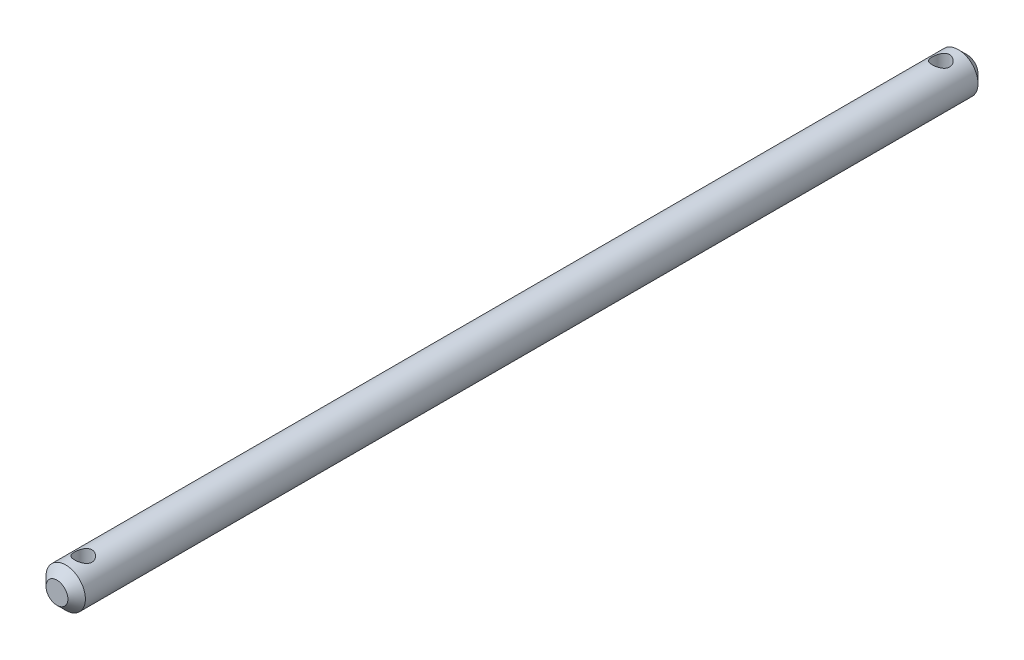
ISO-10303-21;
HEADER;
FILE_DESCRIPTION(('STEP AP214'),'2;1');
FILE_NAME('part.step','',(''),(''),'','','');
FILE_SCHEMA(('AUTOMOTIVE_DESIGN { 1 0 10303 214 1 1 1 1 }'));
ENDSEC;
DATA;
#1=APPLICATION_CONTEXT('core data for automotive mechanical design processes');
#2=APPLICATION_PROTOCOL_DEFINITION('international standard','automotive_design',2000,#1);
#3=PRODUCT_CONTEXT('',#1,'mechanical');
#4=PRODUCT('Part','Part','',(#3));
#5=PRODUCT_RELATED_PRODUCT_CATEGORY('part','',(#4));
#6=PRODUCT_DEFINITION_FORMATION('','',#4);
#7=PRODUCT_DEFINITION_CONTEXT('part definition',#1,'design');
#8=PRODUCT_DEFINITION('design','',#6,#7);
#9=PRODUCT_DEFINITION_SHAPE('','',#8);
#10=(LENGTH_UNIT() NAMED_UNIT(*) SI_UNIT(.MILLI.,.METRE.));
#11=(NAMED_UNIT(*) PLANE_ANGLE_UNIT() SI_UNIT($,.RADIAN.));
#12=(NAMED_UNIT(*) SI_UNIT($,.STERADIAN.) SOLID_ANGLE_UNIT());
#13=UNCERTAINTY_MEASURE_WITH_UNIT(LENGTH_MEASURE(1.E-05),#10,'distance_accuracy_value','');
#14=(GEOMETRIC_REPRESENTATION_CONTEXT(3) GLOBAL_UNCERTAINTY_ASSIGNED_CONTEXT((#13)) GLOBAL_UNIT_ASSIGNED_CONTEXT((#10,
#11,#12)) REPRESENTATION_CONTEXT('',''));
#15=CARTESIAN_POINT('',(0.,0.,0.));
#16=DIRECTION('',(0.,0.,1.));
#17=DIRECTION('',(1.,0.,0.));
#18=AXIS2_PLACEMENT_3D('',#15,#16,#17);
#19=CARTESIAN_POINT('',(0.,0.,104.));
#20=DIRECTION('',(0.,0.,-1.));
#21=DIRECTION('',(-1.,0.,0.));
#22=AXIS2_PLACEMENT_3D('',#19,#20,#21);
#23=CYLINDRICAL_SURFACE('',#22,2.25);
#24=CARTESIAN_POINT('',(0.,-2.25,4.));
#25=CARTESIAN_POINT('',(0.053255465918589,-2.24999511135048,3.99999365264944));
#26=CARTESIAN_POINT('',(0.106577530436506,-2.24808803498228,3.99572124318931));
#27=CARTESIAN_POINT('',(0.211696313341408,-2.24064250175497,3.97879181433044));
#28=CARTESIAN_POINT('',(0.263489053440063,-2.23509531958046,3.96611464801579));
#29=CARTESIAN_POINT('',(0.36385091696647,-2.22096174879085,3.93294949085821));
#30=CARTESIAN_POINT('',(0.412430824006015,-2.21238621117243,3.91248936743266));
#31=CARTESIAN_POINT('',(0.505415730249006,-2.19301475825376,3.86446243318386));
#32=CARTESIAN_POINT('',(0.549821677957486,-2.1822193491909,3.83689724229485));
#33=CARTESIAN_POINT('',(0.635739992499941,-2.15879993616987,3.77383255859854));
#34=CARTESIAN_POINT('',(0.676990818164824,-2.14611090344928,3.73800117271612));
#35=CARTESIAN_POINT('',(0.75312832500485,-2.12059265317293,3.66012587409605));
#36=CARTESIAN_POINT('',(0.788011212567854,-2.10776335684879,3.61807828495734));
#37=CARTESIAN_POINT('',(0.852423036191426,-2.08258023551527,3.52603063733206));
#38=CARTESIAN_POINT('',(0.881526558016591,-2.07029663189321,3.47571159239589));
#39=CARTESIAN_POINT('',(0.930740290188398,-2.04864605580411,3.37027237699269));
#40=CARTESIAN_POINT('',(0.950855750666059,-2.03927738163432,3.31515503186411));
#41=CARTESIAN_POINT('',(0.980405762251773,-2.02523112420835,3.20468980967928));
#42=CARTESIAN_POINT('',(0.990346584909239,-2.02033266269294,3.14950663276957));
#43=CARTESIAN_POINT('',(1.00083914149177,-2.01515731968729,3.03805511494711));
#44=CARTESIAN_POINT('',(1.00139714603473,-2.01487735162058,2.9817875239364));
#45=CARTESIAN_POINT('',(0.993485821512556,-2.01878638355473,2.87515227567846));
#46=CARTESIAN_POINT('',(0.985820019509856,-2.02257762855117,2.82470731541319));
#47=CARTESIAN_POINT('',(0.963040506308283,-2.03352181022502,2.72591238752367));
#48=CARTESIAN_POINT('',(0.947925121354023,-2.04067550235269,2.67756289336113));
#49=CARTESIAN_POINT('',(0.910376035627727,-2.05770428570701,2.58303318613353));
#50=CARTESIAN_POINT('',(0.887785678682018,-2.06763685897519,2.53692602742943));
#51=CARTESIAN_POINT('',(0.836040587446696,-2.08909539162215,2.44896204276294));
#52=CARTESIAN_POINT('',(0.806883089335639,-2.10062202107855,2.40710701712975));
#53=CARTESIAN_POINT('',(0.739504042519738,-2.12533319458153,2.3245431992614));
#54=CARTESIAN_POINT('',(0.70067621379179,-2.13856986016634,2.28434326079129));
#55=CARTESIAN_POINT('',(0.616719106061997,-2.1642744980616,2.21084127822133));
#56=CARTESIAN_POINT('',(0.571587928862101,-2.1767422371801,2.17754131952005));
#57=CARTESIAN_POINT('',(0.474576379255936,-2.19996224486656,2.11789338613898));
#58=CARTESIAN_POINT('',(0.422536018799483,-2.21065295965384,2.09177982840332));
#59=CARTESIAN_POINT('',(0.314203711433233,-2.22862790336672,2.04886152504391));
#60=CARTESIAN_POINT('',(0.25791447035403,-2.23591427938232,2.03205091088851));
#61=CARTESIAN_POINT('',(0.146910267747266,-2.2458412921952,2.00934405865697));
#62=CARTESIAN_POINT('',(0.0923605815208505,-2.24877123051482,2.00276665137451));
#63=CARTESIAN_POINT('',(-0.0171385193954898,-2.2506000193263,1.99864843846558));
#64=CARTESIAN_POINT('',(-0.072087791981941,-2.24950023903332,2.00110456343251));
#65=CARTESIAN_POINT('',(-0.177453708369242,-2.24357647772824,2.01452178634042));
#66=CARTESIAN_POINT('',(-0.227948208866322,-2.23897258878825,2.02498044625975));
#67=CARTESIAN_POINT('',(-0.326396036479248,-2.22675271157043,2.05337898955152));
#68=CARTESIAN_POINT('',(-0.37434905396292,-2.21913635723226,2.07131978213127));
#69=CARTESIAN_POINT('',(-0.46805202596665,-2.20131188670333,2.1147444412052));
#70=CARTESIAN_POINT('',(-0.513686576668193,-2.19103032614157,2.14044617355719));
#71=CARTESIAN_POINT('',(-0.600159639375066,-2.16894061525661,2.19842571300894));
#72=CARTESIAN_POINT('',(-0.640996050392066,-2.15713180090545,2.23070638407268));
#73=CARTESIAN_POINT('',(-0.720183606267881,-2.13206396576625,2.30395838989933));
#74=CARTESIAN_POINT('',(-0.758069193698521,-2.1187647704964,2.34542046874024));
#75=CARTESIAN_POINT('',(-0.826501211331951,-2.09302067475821,2.43427767015777));
#76=CARTESIAN_POINT('',(-0.857045039647483,-2.08057607826871,2.48167488709699));
#77=CARTESIAN_POINT('',(-0.91053786568531,-2.05773895078273,2.58256215390459));
#78=CARTESIAN_POINT('',(-0.933291638639681,-2.04740148035177,2.63616915818437));
#79=CARTESIAN_POINT('',(-0.969232460087627,-2.03063751400259,2.74706340765205));
#80=CARTESIAN_POINT('',(-0.982428871839501,-2.02420719128545,2.80434699085524));
#81=CARTESIAN_POINT('',(-0.997892739114448,-2.01662526778851,2.91574078809814));
#82=CARTESIAN_POINT('',(-1.00099172334628,-2.01507244117414,2.96970843929676));
#83=CARTESIAN_POINT('',(-0.998453874399204,-2.01633144598305,3.0773798015676));
#84=CARTESIAN_POINT('',(-0.99281890399376,-2.01914234671295,3.13108356647087));
#85=CARTESIAN_POINT('',(-0.973701132763465,-2.0284248239616,3.23334596374874));
#86=CARTESIAN_POINT('',(-0.960710860144594,-2.03466599695481,3.28201975994312));
#87=CARTESIAN_POINT('',(-0.927770972929372,-2.04989473409227,3.37649095909925));
#88=CARTESIAN_POINT('',(-0.907819346374625,-2.05888309212992,3.42228752596871));
#89=CARTESIAN_POINT('',(-0.860060545804445,-2.07930527884415,3.51291880581056));
#90=CARTESIAN_POINT('',(-0.831831914674673,-2.09085890484882,3.55750383129051));
#91=CARTESIAN_POINT('',(-0.768867986661113,-2.11482294535827,3.64156240026859));
#92=CARTESIAN_POINT('',(-0.734129972078895,-2.12723371635363,3.68103379711822));
#93=CARTESIAN_POINT('',(-0.655540642347484,-2.15281618226999,3.75731123265171));
#94=CARTESIAN_POINT('',(-0.611157950232165,-2.16595947242195,3.79358208271231));
#95=CARTESIAN_POINT('',(-0.516475905666191,-2.19046588398484,3.85821750727379));
#96=CARTESIAN_POINT('',(-0.466173865202286,-2.20182819113615,3.88657846999122));
#97=CARTESIAN_POINT('',(-0.361525056195782,-2.22139629471516,3.93411230601974));
#98=CARTESIAN_POINT('',(-0.307230454369045,-2.22963633024829,3.95338544637049));
#99=CARTESIAN_POINT('',(-0.195810676259317,-2.24215858416623,3.98231848818));
#100=CARTESIAN_POINT('',(-0.138694699549946,-2.24645287290451,3.99200771459927));
#101=CARTESIAN_POINT('',(-0.0541820162079756,-2.24951242368149,3.99890180769624));
#102=CARTESIAN_POINT('',(-0.0270996306091848,-2.25000248764317,4.00000322991927));
#103=CARTESIAN_POINT('',(0.,-2.25,4.));
#104=B_SPLINE_CURVE_WITH_KNOTS('',3,(#24,#25,#26,#27,#28,#29,#30,#31,#32,#33,#34,#35,#36,#37,
#38,#39,#40,#41,#42,#43,#44,#45,#46,#47,#48,#49,#50,#51,#52,#53,#54,#55,#56,#57,#58,#59,#60,#61,
#62,#63,#64,#65,#66,#67,#68,#69,#70,#71,#72,#73,#74,#75,#76,#77,#78,#79,#80,#81,#82,#83,#84,#85,
#86,#87,#88,#89,#90,#91,#92,#93,#94,#95,#96,#97,#98,#99,#100,#101,#102,#103),.UNSPECIFIED.,.T.,
.F.,(4,2,2,2,2,2,2,2,2,2,2,2,2,2,2,2,2,2,2,2,2,2,2,2,2,2,2,2,2,2,2,2,2,2,2,2,2,2,2,4),(0.,
0.15968187891011,0.319747919519924,0.4792461465493,0.638708040574721,0.806269554300139,
0.973930567049546,1.15127198270406,1.32850967335026,1.49642237746342,1.66422285961175,
1.81700425015333,1.96981998293039,2.12606592660329,2.28237775061561,2.45391673374921,
2.62550748617086,2.80216697951325,2.97871490418316,3.1429140648838,3.30705743927524,
3.46166393102078,3.61628921558037,3.7757384777183,3.93525730063716,4.1076325833433,
4.28006886532161,4.45655507823355,4.63286815448326,4.79423699929667,4.95557143217939,
5.10719982475701,5.2588720770592,5.4202634852214,5.58172242580081,5.75730509177075,
5.93296780087361,6.10664422570444,6.27978757430918,6.36104345779088),.UNSPECIFIED.);
#105=CARTESIAN_POINT('',(0.,-2.25,4.));
#106=VERTEX_POINT('',#105);
#107=EDGE_CURVE('E10',#106,#106,#104,.T.);
#108=ORIENTED_EDGE('',*,*,#107,.T.);
#109=EDGE_LOOP('',(#108));
#110=FACE_BOUND('',#109,.T.);
#111=CARTESIAN_POINT('',(0.,2.25,4.));
#112=CARTESIAN_POINT('',(-0.0532554659185883,2.24999511135048,3.99999365264944));
#113=CARTESIAN_POINT('',(-0.106577530436506,2.24808803498228,3.99572124318931));
#114=CARTESIAN_POINT('',(-0.211696313341407,2.24064250175497,3.97879181433044));
#115=CARTESIAN_POINT('',(-0.263489053440062,2.23509531958046,3.96611464801579));
#116=CARTESIAN_POINT('',(-0.363850916966469,2.22096174879085,3.93294949085821));
#117=CARTESIAN_POINT('',(-0.412430824006014,2.21238621117243,3.91248936743266));
#118=CARTESIAN_POINT('',(-0.505415730249005,2.19301475825376,3.86446243318386));
#119=CARTESIAN_POINT('',(-0.549821677957485,2.1822193491909,3.83689724229485));
#120=CARTESIAN_POINT('',(-0.635739992499941,2.15879993616987,3.77383255859854));
#121=CARTESIAN_POINT('',(-0.676990818164823,2.14611090344928,3.73800117271611));
#122=CARTESIAN_POINT('',(-0.753128325004849,2.12059265317293,3.66012587409605));
#123=CARTESIAN_POINT('',(-0.788011212567853,2.10776335684879,3.61807828495734));
#124=CARTESIAN_POINT('',(-0.852423036191425,2.08258023551527,3.52603063733206));
#125=CARTESIAN_POINT('',(-0.88152655801659,2.07029663189321,3.47571159239589));
#126=CARTESIAN_POINT('',(-0.930740290188397,2.04864605580411,3.37027237699269));
#127=CARTESIAN_POINT('',(-0.950855750666058,2.03927738163432,3.31515503186411));
#128=CARTESIAN_POINT('',(-0.980405762251772,2.02523112420835,3.20468980967928));
#129=CARTESIAN_POINT('',(-0.990346584909238,2.02033266269295,3.14950663276957));
#130=CARTESIAN_POINT('',(-1.00083914149177,2.01515731968729,3.03805511494712));
#131=CARTESIAN_POINT('',(-1.00139714603473,2.01487735162058,2.9817875239364));
#132=CARTESIAN_POINT('',(-0.993485821512556,2.01878638355473,2.87515227567846));
#133=CARTESIAN_POINT('',(-0.985820019509855,2.02257762855117,2.82470731541319));
#134=CARTESIAN_POINT('',(-0.963040506308283,2.03352181022502,2.72591238752367));
#135=CARTESIAN_POINT('',(-0.947925121354023,2.04067550235269,2.67756289336113));
#136=CARTESIAN_POINT('',(-0.910376035627726,2.05770428570701,2.58303318613353));
#137=CARTESIAN_POINT('',(-0.887785678682017,2.06763685897519,2.53692602742943));
#138=CARTESIAN_POINT('',(-0.836040587446696,2.08909539162215,2.44896204276294));
#139=CARTESIAN_POINT('',(-0.806883089335638,2.10062202107855,2.40710701712975));
#140=CARTESIAN_POINT('',(-0.739504042519738,2.12533319458153,2.3245431992614));
#141=CARTESIAN_POINT('',(-0.70067621379179,2.13856986016634,2.28434326079129));
#142=CARTESIAN_POINT('',(-0.616719106061997,2.1642744980616,2.21084127822133));
#143=CARTESIAN_POINT('',(-0.571587928862101,2.1767422371801,2.17754131952005));
#144=CARTESIAN_POINT('',(-0.474576379255936,2.19996224486656,2.11789338613898));
#145=CARTESIAN_POINT('',(-0.422536018799484,2.21065295965384,2.09177982840332));
#146=CARTESIAN_POINT('',(-0.314203711433234,2.22862790336672,2.04886152504391));
#147=CARTESIAN_POINT('',(-0.25791447035403,2.23591427938232,2.03205091088851));
#148=CARTESIAN_POINT('',(-0.146910267747267,2.2458412921952,2.00934405865697));
#149=CARTESIAN_POINT('',(-0.0923605815208506,2.24877123051482,2.00276665137451));
#150=CARTESIAN_POINT('',(0.0171385193954898,2.2506000193263,1.99864843846558));
#151=CARTESIAN_POINT('',(0.0720877919819411,2.24950023903332,2.00110456343251));
#152=CARTESIAN_POINT('',(0.177453708369242,2.24357647772824,2.01452178634042));
#153=CARTESIAN_POINT('',(0.227948208866322,2.23897258878825,2.02498044625975));
#154=CARTESIAN_POINT('',(0.326396036479248,2.22675271157043,2.05337898955152));
#155=CARTESIAN_POINT('',(0.37434905396292,2.21913635723226,2.07131978213127));
#156=CARTESIAN_POINT('',(0.46805202596665,2.20131188670333,2.1147444412052));
#157=CARTESIAN_POINT('',(0.513686576668194,2.19103032614157,2.14044617355719));
#158=CARTESIAN_POINT('',(0.600159639375066,2.16894061525661,2.19842571300894));
#159=CARTESIAN_POINT('',(0.640996050392066,2.15713180090545,2.23070638407268));
#160=CARTESIAN_POINT('',(0.720183606267881,2.13206396576625,2.30395838989933));
#161=CARTESIAN_POINT('',(0.758069193698521,2.1187647704964,2.34542046874024));
#162=CARTESIAN_POINT('',(0.826501211331951,2.09302067475821,2.43427767015777));
#163=CARTESIAN_POINT('',(0.857045039647483,2.08057607826871,2.48167488709699));
#164=CARTESIAN_POINT('',(0.910537865685311,2.05773895078273,2.58256215390459));
#165=CARTESIAN_POINT('',(0.933291638639681,2.04740148035177,2.63616915818437));
#166=CARTESIAN_POINT('',(0.969232460087628,2.03063751400259,2.74706340765205));
#167=CARTESIAN_POINT('',(0.982428871839502,2.02420719128545,2.80434699085524));
#168=CARTESIAN_POINT('',(0.997892739114449,2.01662526778851,2.91574078809814));
#169=CARTESIAN_POINT('',(1.00099172334628,2.01507244117414,2.96970843929676));
#170=CARTESIAN_POINT('',(0.998453874399204,2.01633144598305,3.0773798015676));
#171=CARTESIAN_POINT('',(0.992818903993761,2.01914234671295,3.13108356647087));
#172=CARTESIAN_POINT('',(0.973701132763466,2.0284248239616,3.23334596374874));
#173=CARTESIAN_POINT('',(0.960710860144595,2.03466599695481,3.28201975994312));
#174=CARTESIAN_POINT('',(0.927770972929373,2.04989473409227,3.37649095909925));
#175=CARTESIAN_POINT('',(0.907819346374626,2.05888309212992,3.42228752596871));
#176=CARTESIAN_POINT('',(0.860060545804446,2.07930527884415,3.51291880581056));
#177=CARTESIAN_POINT('',(0.831831914674674,2.09085890484882,3.55750383129051));
#178=CARTESIAN_POINT('',(0.768867986661115,2.11482294535827,3.64156240026859));
#179=CARTESIAN_POINT('',(0.734129972078896,2.12723371635363,3.68103379711822));
#180=CARTESIAN_POINT('',(0.655540642347485,2.15281618226999,3.75731123265171));
#181=CARTESIAN_POINT('',(0.611157950232167,2.16595947242195,3.79358208271231));
#182=CARTESIAN_POINT('',(0.516475905666193,2.19046588398484,3.85821750727379));
#183=CARTESIAN_POINT('',(0.466173865202287,2.20182819113615,3.88657846999122));
#184=CARTESIAN_POINT('',(0.361525056195783,2.22139629471516,3.93411230601974));
#185=CARTESIAN_POINT('',(0.307230454369046,2.22963633024829,3.95338544637049));
#186=CARTESIAN_POINT('',(0.195810676259318,2.24215858416623,3.98231848818));
#187=CARTESIAN_POINT('',(0.138694699549947,2.24645287290451,3.99200771459927));
#188=CARTESIAN_POINT('',(0.0541820162079769,2.24951242368149,3.99890180769624));
#189=CARTESIAN_POINT('',(0.0270996306091858,2.25000248764317,4.00000322991927));
#190=CARTESIAN_POINT('',(0.,2.25,4.));
#191=B_SPLINE_CURVE_WITH_KNOTS('',3,(#111,#112,#113,#114,#115,#116,#117,#118,#119,#120,#121,
#122,#123,#124,#125,#126,#127,#128,#129,#130,#131,#132,#133,#134,#135,#136,#137,#138,#139,#140,
#141,#142,#143,#144,#145,#146,#147,#148,#149,#150,#151,#152,#153,#154,#155,#156,#157,#158,#159,
#160,#161,#162,#163,#164,#165,#166,#167,#168,#169,#170,#171,#172,#173,#174,#175,#176,#177,#178,
#179,#180,#181,#182,#183,#184,#185,#186,#187,#188,#189,#190),.UNSPECIFIED.,.T.,.F.,(4,2,2,2,2,2,
2,2,2,2,2,2,2,2,2,2,2,2,2,2,2,2,2,2,2,2,2,2,2,2,2,2,2,2,2,2,2,2,2,4),(0.,0.15968187891011,
0.319747919519923,0.4792461465493,0.638708040574721,0.806269554300139,0.973930567049546,
1.15127198270406,1.32850967335026,1.49642237746342,1.66422285961175,1.81700425015333,
1.96981998293039,2.12606592660329,2.28237775061561,2.45391673374921,2.62550748617086,
2.80216697951325,2.97871490418316,3.1429140648838,3.30705743927524,3.46166393102077,
3.61628921558037,3.7757384777183,3.93525730063716,4.1076325833433,4.28006886532161,
4.45655507823355,4.63286815448326,4.79423699929666,4.95557143217939,5.10719982475701,
5.2588720770592,5.4202634852214,5.58172242580081,5.75730509177075,5.93296780087361,
6.10664422570444,6.27978757430918,6.36104345779088),.UNSPECIFIED.);
#192=CARTESIAN_POINT('',(0.,2.25,4.));
#193=VERTEX_POINT('',#192);
#194=EDGE_CURVE('E41',#193,#193,#191,.T.);
#195=ORIENTED_EDGE('',*,*,#194,.T.);
#196=EDGE_LOOP('',(#195));
#197=FACE_BOUND('',#196,.T.);
#198=CARTESIAN_POINT('',(0.,-2.25,102.));
#199=CARTESIAN_POINT('',(0.0532554659185895,-2.24999511135048,101.999993652649));
#200=CARTESIAN_POINT('',(0.106577530436508,-2.24808803498228,101.995721243189));
#201=CARTESIAN_POINT('',(0.211696313341409,-2.24064250175497,101.97879181433));
#202=CARTESIAN_POINT('',(0.263489053440063,-2.23509531958046,101.966114648016));
#203=CARTESIAN_POINT('',(0.363850916966471,-2.22096174879085,101.932949490858));
#204=CARTESIAN_POINT('',(0.412430824006017,-2.21238621117243,101.912489367433));
#205=CARTESIAN_POINT('',(0.505415730249009,-2.19301475825376,101.864462433184));
#206=CARTESIAN_POINT('',(0.549821677957488,-2.1822193491909,101.836897242295));
#207=CARTESIAN_POINT('',(0.635739992499944,-2.15879993616987,101.773832558599));
#208=CARTESIAN_POINT('',(0.676990818164828,-2.14611090344928,101.738001172716));
#209=CARTESIAN_POINT('',(0.753128325004852,-2.12059265317293,101.660125874096));
#210=CARTESIAN_POINT('',(0.788011212567854,-2.10776335684879,101.618078284957));
#211=CARTESIAN_POINT('',(0.852423036191424,-2.08258023551527,101.526030637332));
#212=CARTESIAN_POINT('',(0.881526558016589,-2.07029663189321,101.475711592396));
#213=CARTESIAN_POINT('',(0.930740290188398,-2.04864605580411,101.370272376993));
#214=CARTESIAN_POINT('',(0.95085575066606,-2.03927738163432,101.315155031864));
#215=CARTESIAN_POINT('',(0.980405762251776,-2.02523112420834,101.204689809679));
#216=CARTESIAN_POINT('',(0.990346584909241,-2.02033266269294,101.14950663277));
#217=CARTESIAN_POINT('',(1.00083914149177,-2.01515731968728,101.038055114947));
#218=CARTESIAN_POINT('',(1.00139714603473,-2.01487735162058,100.981787523936));
#219=CARTESIAN_POINT('',(0.993485821512556,-2.01878638355473,100.875152275679));
#220=CARTESIAN_POINT('',(0.985820019509856,-2.02257762855117,100.824707315413));
#221=CARTESIAN_POINT('',(0.963040506308284,-2.03352181022502,100.725912387524));
#222=CARTESIAN_POINT('',(0.947925121354024,-2.04067550235269,100.677562893361));
#223=CARTESIAN_POINT('',(0.910376035627729,-2.05770428570701,100.583033186134));
#224=CARTESIAN_POINT('',(0.88778567868202,-2.06763685897519,100.536926027429));
#225=CARTESIAN_POINT('',(0.836040587446697,-2.08909539162215,100.448962042763));
#226=CARTESIAN_POINT('',(0.806883089335639,-2.10062202107855,100.40710701713));
#227=CARTESIAN_POINT('',(0.73950404251974,-2.12533319458152,100.324543199261));
#228=CARTESIAN_POINT('',(0.700676213791795,-2.13856986016634,100.284343260791));
#229=CARTESIAN_POINT('',(0.616719106062004,-2.1642744980616,100.210841278221));
#230=CARTESIAN_POINT('',(0.571587928862107,-2.1767422371801,100.17754131952));
#231=CARTESIAN_POINT('',(0.474576379255939,-2.19996224486656,100.117893386139));
#232=CARTESIAN_POINT('',(0.422536018799485,-2.21065295965384,100.091779828403));
#233=CARTESIAN_POINT('',(0.314203711433235,-2.22862790336672,100.048861525044));
#234=CARTESIAN_POINT('',(0.257914470354032,-2.23591427938232,100.032050910889));
#235=CARTESIAN_POINT('',(0.146910267747267,-2.2458412921952,100.009344058657));
#236=CARTESIAN_POINT('',(0.0923605815208501,-2.24877123051482,100.002766651375));
#237=CARTESIAN_POINT('',(-0.017138519395492,-2.2506000193263,99.9986484384656));
#238=CARTESIAN_POINT('',(-0.0720877919819438,-2.24950023903332,100.001104563433));
#239=CARTESIAN_POINT('',(-0.177453708369246,-2.24357647772824,100.01452178634));
#240=CARTESIAN_POINT('',(-0.227948208866326,-2.23897258878825,100.02498044626));
#241=CARTESIAN_POINT('',(-0.326396036479251,-2.22675271157043,100.053378989552));
#242=CARTESIAN_POINT('',(-0.374349053962921,-2.21913635723226,100.071319782131));
#243=CARTESIAN_POINT('',(-0.468052025966652,-2.20131188670333,100.114744441205));
#244=CARTESIAN_POINT('',(-0.513686576668199,-2.19103032614157,100.140446173557));
#245=CARTESIAN_POINT('',(-0.600159639375071,-2.16894061525661,100.198425713009));
#246=CARTESIAN_POINT('',(-0.640996050392068,-2.15713180090545,100.230706384073));
#247=CARTESIAN_POINT('',(-0.720183606267881,-2.13206396576625,100.303958389899));
#248=CARTESIAN_POINT('',(-0.758069193698524,-2.1187647704964,100.34542046874));
#249=CARTESIAN_POINT('',(-0.826501211331953,-2.09302067475821,100.434277670158));
#250=CARTESIAN_POINT('',(-0.857045039647483,-2.08057607826871,100.481674887097));
#251=CARTESIAN_POINT('',(-0.910537865685309,-2.05773895078273,100.582562153905));
#252=CARTESIAN_POINT('',(-0.93329163863968,-2.04740148035177,100.636169158184));
#253=CARTESIAN_POINT('',(-0.969232460087627,-2.03063751400259,100.747063407652));
#254=CARTESIAN_POINT('',(-0.982428871839502,-2.02420719128545,100.804346990855));
#255=CARTESIAN_POINT('',(-0.997892739114449,-2.01662526778851,100.915740788098));
#256=CARTESIAN_POINT('',(-1.00099172334628,-2.01507244117414,100.969708439297));
#257=CARTESIAN_POINT('',(-0.998453874399204,-2.01633144598305,101.077379801568));
#258=CARTESIAN_POINT('',(-0.992818903993759,-2.01914234671295,101.131083566471));
#259=CARTESIAN_POINT('',(-0.973701132763463,-2.02842482396161,101.233345963749));
#260=CARTESIAN_POINT('',(-0.960710860144593,-2.03466599695481,101.282019759943));
#261=CARTESIAN_POINT('',(-0.927770972929372,-2.04989473409227,101.376490959099));
#262=CARTESIAN_POINT('',(-0.907819346374625,-2.05888309212992,101.422287525969));
#263=CARTESIAN_POINT('',(-0.860060545804446,-2.07930527884415,101.512918805811));
#264=CARTESIAN_POINT('',(-0.831831914674676,-2.09085890484881,101.557503831291));
#265=CARTESIAN_POINT('',(-0.768867986661116,-2.11482294535827,101.641562400269));
#266=CARTESIAN_POINT('',(-0.734129972078896,-2.12723371635363,101.681033797118));
#267=CARTESIAN_POINT('',(-0.655540642347484,-2.15281618226999,101.757311232652));
#268=CARTESIAN_POINT('',(-0.611157950232167,-2.16595947242195,101.793582082712));
#269=CARTESIAN_POINT('',(-0.516475905666194,-2.19046588398484,101.858217507274));
#270=CARTESIAN_POINT('',(-0.466173865202288,-2.20182819113615,101.886578469991));
#271=CARTESIAN_POINT('',(-0.361525056195782,-2.22139629471516,101.93411230602));
#272=CARTESIAN_POINT('',(-0.307230454369043,-2.22963633024829,101.953385446371));
#273=CARTESIAN_POINT('',(-0.195810676259314,-2.24215858416623,101.98231848818));
#274=CARTESIAN_POINT('',(-0.138694699549945,-2.24645287290451,101.992007714599));
#275=CARTESIAN_POINT('',(-0.0541820162079758,-2.24951242368149,101.998901807696));
#276=CARTESIAN_POINT('',(-0.027099630609185,-2.25000248764317,102.000003229919));
#277=CARTESIAN_POINT('',(0.,-2.25,102.));
#278=B_SPLINE_CURVE_WITH_KNOTS('',3,(#198,#199,#200,#201,#202,#203,#204,#205,#206,#207,#208,
#209,#210,#211,#212,#213,#214,#215,#216,#217,#218,#219,#220,#221,#222,#223,#224,#225,#226,#227,
#228,#229,#230,#231,#232,#233,#234,#235,#236,#237,#238,#239,#240,#241,#242,#243,#244,#245,#246,
#247,#248,#249,#250,#251,#252,#253,#254,#255,#256,#257,#258,#259,#260,#261,#262,#263,#264,#265,
#266,#267,#268,#269,#270,#271,#272,#273,#274,#275,#276,#277),.UNSPECIFIED.,.T.,.F.,(4,2,2,2,2,2,
2,2,2,2,2,2,2,2,2,2,2,2,2,2,2,2,2,2,2,2,2,2,2,2,2,2,2,2,2,2,2,2,2,4),(0.,0.159681878910111,
0.319747919519926,0.479246146549304,0.63870804057472,0.806269554300147,0.973930567049547,
1.15127198270406,1.32850967335026,1.49642237746343,1.66422285961175,1.81700425015334,
1.96981998293039,2.12606592660329,2.28237775061561,2.4539167337492,2.62550748617087,
2.80216697951325,2.97871490418316,3.14291406488381,3.30705743927525,3.46166393102078,
3.61628921558038,3.7757384777183,3.93525730063717,4.10763258334331,4.28006886532161,
4.45655507823355,4.63286815448326,4.79423699929667,4.9555714321794,5.10719982475702,
5.25887207705921,5.4202634852214,5.58172242580081,5.75730509177075,5.93296780087361,
6.10664422570444,6.27978757430918,6.36104345779088),.UNSPECIFIED.);
#279=CARTESIAN_POINT('',(0.,-2.25,102.));
#280=VERTEX_POINT('',#279);
#281=EDGE_CURVE('E45',#280,#280,#278,.T.);
#282=ORIENTED_EDGE('',*,*,#281,.T.);
#283=EDGE_LOOP('',(#282));
#284=FACE_BOUND('',#283,.T.);
#285=CARTESIAN_POINT('',(0.,2.25,102.));
#286=CARTESIAN_POINT('',(-0.0532554659185888,2.24999511135048,101.999993652649));
#287=CARTESIAN_POINT('',(-0.106577530436507,2.24808803498228,101.995721243189));
#288=CARTESIAN_POINT('',(-0.211696313341408,2.24064250175497,101.97879181433));
#289=CARTESIAN_POINT('',(-0.263489053440062,2.23509531958046,101.966114648016));
#290=CARTESIAN_POINT('',(-0.363850916966472,2.22096174879085,101.932949490858));
#291=CARTESIAN_POINT('',(-0.41243082400602,2.21238621117243,101.912489367433));
#292=CARTESIAN_POINT('',(-0.505415730249012,2.19301475825376,101.864462433184));
#293=CARTESIAN_POINT('',(-0.549821677957489,2.1822193491909,101.836897242295));
#294=CARTESIAN_POINT('',(-0.635739992499943,2.15879993616987,101.773832558599));
#295=CARTESIAN_POINT('',(-0.676990818164827,2.14611090344928,101.738001172716));
#296=CARTESIAN_POINT('',(-0.753128325004851,2.12059265317293,101.660125874096));
#297=CARTESIAN_POINT('',(-0.788011212567853,2.10776335684879,101.618078284957));
#298=CARTESIAN_POINT('',(-0.852423036191424,2.08258023551527,101.526030637332));
#299=CARTESIAN_POINT('',(-0.881526558016588,2.07029663189321,101.475711592396));
#300=CARTESIAN_POINT('',(-0.930740290188397,2.04864605580411,101.370272376993));
#301=CARTESIAN_POINT('',(-0.95085575066606,2.03927738163432,101.315155031864));
#302=CARTESIAN_POINT('',(-0.980405762251773,2.02523112420835,101.204689809679));
#303=CARTESIAN_POINT('',(-0.990346584909237,2.02033266269295,101.14950663277));
#304=CARTESIAN_POINT('',(-1.00083914149177,2.01515731968729,101.038055114947));
#305=CARTESIAN_POINT('',(-1.00139714603473,2.01487735162058,100.981787523936));
#306=CARTESIAN_POINT('',(-0.993485821512557,2.01878638355473,100.875152275679));
#307=CARTESIAN_POINT('',(-0.985820019509858,2.02257762855117,100.824707315413));
#308=CARTESIAN_POINT('',(-0.963040506308286,2.03352181022502,100.725912387524));
#309=CARTESIAN_POINT('',(-0.947925121354025,2.04067550235269,100.677562893361));
#310=CARTESIAN_POINT('',(-0.910376035627728,2.05770428570701,100.583033186134));
#311=CARTESIAN_POINT('',(-0.887785678682019,2.06763685897519,100.536926027429));
#312=CARTESIAN_POINT('',(-0.836040587446696,2.08909539162215,100.448962042763));
#313=CARTESIAN_POINT('',(-0.806883089335638,2.10062202107855,100.40710701713));
#314=CARTESIAN_POINT('',(-0.739504042519736,2.12533319458153,100.324543199261));
#315=CARTESIAN_POINT('',(-0.700676213791787,2.13856986016634,100.284343260791));
#316=CARTESIAN_POINT('',(-0.616719106061994,2.1642744980616,100.210841278221));
#317=CARTESIAN_POINT('',(-0.571587928862101,2.1767422371801,100.17754131952));
#318=CARTESIAN_POINT('',(-0.474576379255938,2.19996224486656,100.117893386139));
#319=CARTESIAN_POINT('',(-0.422536018799485,2.21065295965384,100.091779828403));
#320=CARTESIAN_POINT('',(-0.314203711433235,2.22862790336672,100.048861525044));
#321=CARTESIAN_POINT('',(-0.257914470354032,2.23591427938232,100.032050910889));
#322=CARTESIAN_POINT('',(-0.146910267747268,2.2458412921952,100.009344058657));
#323=CARTESIAN_POINT('',(-0.0923605815208511,2.24877123051482,100.002766651375));
#324=CARTESIAN_POINT('',(0.0171385193954907,2.2506000193263,99.9986484384656));
#325=CARTESIAN_POINT('',(0.0720877919819424,2.24950023903332,100.001104563433));
#326=CARTESIAN_POINT('',(0.177453708369245,2.24357647772824,100.01452178634));
#327=CARTESIAN_POINT('',(0.227948208866325,2.23897258878825,100.02498044626));
#328=CARTESIAN_POINT('',(0.32639603647925,2.22675271157043,100.053378989552));
#329=CARTESIAN_POINT('',(0.37434905396292,2.21913635723226,100.071319782131));
#330=CARTESIAN_POINT('',(0.468052025966651,2.20131188670333,100.114744441205));
#331=CARTESIAN_POINT('',(0.513686576668197,2.19103032614157,100.140446173557));
#332=CARTESIAN_POINT('',(0.60015963937507,2.16894061525661,100.198425713009));
#333=CARTESIAN_POINT('',(0.640996050392069,2.15713180090545,100.230706384073));
#334=CARTESIAN_POINT('',(0.720183606267886,2.13206396576625,100.303958389899));
#335=CARTESIAN_POINT('',(0.758069193698528,2.11876477049639,100.34542046874));
#336=CARTESIAN_POINT('',(0.826501211331954,2.09302067475821,100.434277670158));
#337=CARTESIAN_POINT('',(0.857045039647482,2.08057607826871,100.481674887097));
#338=CARTESIAN_POINT('',(0.910537865685307,2.05773895078273,100.582562153905));
#339=CARTESIAN_POINT('',(0.93329163863968,2.04740148035177,100.636169158184));
#340=CARTESIAN_POINT('',(0.969232460087628,2.03063751400259,100.747063407652));
#341=CARTESIAN_POINT('',(0.982428871839503,2.02420719128545,100.804346990855));
#342=CARTESIAN_POINT('',(0.99789273911445,2.01662526778851,100.915740788098));
#343=CARTESIAN_POINT('',(1.00099172334628,2.01507244117414,100.969708439297));
#344=CARTESIAN_POINT('',(0.998453874399205,2.01633144598305,101.077379801568));
#345=CARTESIAN_POINT('',(0.99281890399376,2.01914234671295,101.131083566471));
#346=CARTESIAN_POINT('',(0.973701132763464,2.0284248239616,101.233345963749));
#347=CARTESIAN_POINT('',(0.960710860144593,2.03466599695481,101.282019759943));
#348=CARTESIAN_POINT('',(0.927770972929373,2.04989473409227,101.376490959099));
#349=CARTESIAN_POINT('',(0.907819346374625,2.05888309212992,101.422287525969));
#350=CARTESIAN_POINT('',(0.860060545804447,2.07930527884415,101.512918805811));
#351=CARTESIAN_POINT('',(0.831831914674676,2.09085890484881,101.557503831291));
#352=CARTESIAN_POINT('',(0.768867986661117,2.11482294535827,101.641562400269));
#353=CARTESIAN_POINT('',(0.734129972078897,2.12723371635363,101.681033797118));
#354=CARTESIAN_POINT('',(0.655540642347485,2.15281618226999,101.757311232652));
#355=CARTESIAN_POINT('',(0.611157950232168,2.16595947242195,101.793582082712));
#356=CARTESIAN_POINT('',(0.516475905666195,2.19046588398484,101.858217507274));
#357=CARTESIAN_POINT('',(0.466173865202289,2.20182819113615,101.886578469991));
#358=CARTESIAN_POINT('',(0.361525056195783,2.22139629471516,101.93411230602));
#359=CARTESIAN_POINT('',(0.307230454369045,2.22963633024829,101.953385446371));
#360=CARTESIAN_POINT('',(0.195810676259315,2.24215858416623,101.98231848818));
#361=CARTESIAN_POINT('',(0.138694699549947,2.24645287290451,101.992007714599));
#362=CARTESIAN_POINT('',(0.054182016207977,2.24951242368149,101.998901807696));
#363=CARTESIAN_POINT('',(0.0270996306091859,2.25000248764317,102.000003229919));
#364=CARTESIAN_POINT('',(0.,2.25,102.));
#365=B_SPLINE_CURVE_WITH_KNOTS('',3,(#285,#286,#287,#288,#289,#290,#291,#292,#293,#294,#295,
#296,#297,#298,#299,#300,#301,#302,#303,#304,#305,#306,#307,#308,#309,#310,#311,#312,#313,#314,
#315,#316,#317,#318,#319,#320,#321,#322,#323,#324,#325,#326,#327,#328,#329,#330,#331,#332,#333,
#334,#335,#336,#337,#338,#339,#340,#341,#342,#343,#344,#345,#346,#347,#348,#349,#350,#351,#352,
#353,#354,#355,#356,#357,#358,#359,#360,#361,#362,#363,#364),.UNSPECIFIED.,.T.,.F.,(4,2,2,2,2,2,
2,2,2,2,2,2,2,2,2,2,2,2,2,2,2,2,2,2,2,2,2,2,2,2,2,2,2,2,2,2,2,2,2,4),(0.,0.159681878910111,
0.319747919519926,0.479246146549309,0.63870804057472,0.806269554300148,0.973930567049547,
1.15127198270406,1.32850967335026,1.4964223774634,1.66422285961174,1.81700425015332,
1.96981998293039,2.12606592660329,2.28237775061561,2.45391673374922,2.62550748617087,
2.80216697951325,2.97871490418316,3.14291406488381,3.30705743927525,3.46166393102078,
3.61628921558037,3.7757384777183,3.93525730063716,4.10763258334332,4.2800688653216,
4.45655507823355,4.63286815448326,4.79423699929667,4.95557143217941,5.10719982475702,
5.25887207705922,5.4202634852214,5.58172242580082,5.75730509177075,5.93296780087361,
6.10664422570445,6.27978757430918,6.36104345779089),.UNSPECIFIED.);
#366=CARTESIAN_POINT('',(0.,2.25,102.));
#367=VERTEX_POINT('',#366);
#368=EDGE_CURVE('E49',#367,#367,#365,.T.);
#369=ORIENTED_EDGE('',*,*,#368,.T.);
#370=EDGE_LOOP('',(#369));
#371=FACE_BOUND('',#370,.T.);
#372=CARTESIAN_POINT('',(0.,0.,1.00000000000003));
#373=DIRECTION('',(0.,0.,1.));
#374=DIRECTION('',(1.,0.,0.));
#375=AXIS2_PLACEMENT_3D('',#372,#373,#374);
#376=CIRCLE('',#375,2.25);
#377=CARTESIAN_POINT('',(2.25,0.,1.00000000000003));
#378=VERTEX_POINT('',#377);
#379=EDGE_CURVE('E81',#378,#378,#376,.T.);
#380=ORIENTED_EDGE('',*,*,#379,.T.);
#381=EDGE_LOOP('',(#380));
#382=FACE_BOUND('',#381,.T.);
#383=CARTESIAN_POINT('',(0.,0.,103.));
#384=DIRECTION('',(0.,0.,1.));
#385=DIRECTION('',(1.,0.,0.));
#386=AXIS2_PLACEMENT_3D('',#383,#384,#385);
#387=CIRCLE('',#386,2.25);
#388=CARTESIAN_POINT('',(2.25,0.,103.));
#389=VERTEX_POINT('',#388);
#390=EDGE_CURVE('E84',#389,#389,#387,.F.);
#391=ORIENTED_EDGE('',*,*,#390,.T.);
#392=EDGE_LOOP('',(#391));
#393=FACE_BOUND('',#392,.T.);
#394=ADVANCED_FACE('F30',(#110,#197,#284,#371,#382,#393),#23,.T.);
#395=CARTESIAN_POINT('',(0.,0.,104.));
#396=DIRECTION('',(0.,0.,1.));
#397=DIRECTION('',(1.,0.,0.));
#398=AXIS2_PLACEMENT_3D('',#395,#396,#397);
#399=PLANE('',#398);
#400=CARTESIAN_POINT('',(0.,0.,104.));
#401=DIRECTION('',(0.,0.,1.));
#402=DIRECTION('',(1.,0.,0.));
#403=AXIS2_PLACEMENT_3D('',#400,#401,#402);
#404=CIRCLE('',#403,1.25000000000006);
#405=CARTESIAN_POINT('',(1.25000000000006,0.,104.));
#406=VERTEX_POINT('',#405);
#407=EDGE_CURVE('E75',#406,#406,#404,.T.);
#408=ORIENTED_EDGE('',*,*,#407,.T.);
#409=EDGE_LOOP('',(#408));
#410=FACE_BOUND('',#409,.T.);
#411=ADVANCED_FACE('F69',(#410),#399,.T.);
#412=CARTESIAN_POINT('',(0.,0.,0.));
#413=DIRECTION('',(0.,0.,1.));
#414=DIRECTION('',(1.,0.,0.));
#415=AXIS2_PLACEMENT_3D('',#412,#413,#414);
#416=PLANE('',#415);
#417=CARTESIAN_POINT('',(0.,0.,0.));
#418=DIRECTION('',(0.,0.,1.));
#419=DIRECTION('',(1.,0.,0.));
#420=AXIS2_PLACEMENT_3D('',#417,#418,#419);
#421=CIRCLE('',#420,1.24999999999996);
#422=CARTESIAN_POINT('',(1.24999999999996,0.,0.));
#423=VERTEX_POINT('',#422);
#424=EDGE_CURVE('E78',#423,#423,#421,.F.);
#425=ORIENTED_EDGE('',*,*,#424,.T.);
#426=EDGE_LOOP('',(#425));
#427=FACE_BOUND('',#426,.T.);
#428=ADVANCED_FACE('F95',(#427),#416,.F.);
#429=CARTESIAN_POINT('',(0.,0.,1.00000000000003));
#430=DIRECTION('',(0.,0.,1.));
#431=DIRECTION('',(1.,0.,0.));
#432=AXIS2_PLACEMENT_3D('',#429,#430,#431);
#433=CONICAL_SURFACE('',#432,2.25,0.785398163397454);
#434=ORIENTED_EDGE('',*,*,#424,.F.);
#435=EDGE_LOOP('',(#434));
#436=FACE_BOUND('',#435,.T.);
#437=ORIENTED_EDGE('',*,*,#379,.F.);
#438=EDGE_LOOP('',(#437));
#439=FACE_BOUND('',#438,.T.);
#440=ADVANCED_FACE('F91',(#436,#439),#433,.T.);
#441=CARTESIAN_POINT('',(0.,0.,104.));
#442=DIRECTION('',(0.,0.,-1.));
#443=DIRECTION('',(-1.,0.,0.));
#444=AXIS2_PLACEMENT_3D('',#441,#442,#443);
#445=CONICAL_SURFACE('',#444,1.25000000000006,0.785398163397447);
#446=ORIENTED_EDGE('',*,*,#390,.F.);
#447=EDGE_LOOP('',(#446));
#448=FACE_BOUND('',#447,.T.);
#449=ORIENTED_EDGE('',*,*,#407,.F.);
#450=EDGE_LOOP('',(#449));
#451=FACE_BOUND('',#450,.T.);
#452=ADVANCED_FACE('F32',(#448,#451),#445,.T.);
#453=CARTESIAN_POINT('',(0.,-2.25,101.));
#454=DIRECTION('',(0.,1.,0.));
#455=DIRECTION('',(0.,0.,1.));
#456=AXIS2_PLACEMENT_3D('',#453,#454,#455);
#457=CYLINDRICAL_SURFACE('',#456,1.);
#458=ORIENTED_EDGE('',*,*,#368,.F.);
#459=EDGE_LOOP('',(#458));
#460=FACE_BOUND('',#459,.T.);
#461=ORIENTED_EDGE('',*,*,#281,.F.);
#462=EDGE_LOOP('',(#461));
#463=FACE_BOUND('',#462,.T.);
#464=ADVANCED_FACE('F62',(#460,#463),#457,.F.);
#465=CARTESIAN_POINT('',(0.,-2.25,3.));
#466=DIRECTION('',(0.,1.,0.));
#467=DIRECTION('',(0.,0.,1.));
#468=AXIS2_PLACEMENT_3D('',#465,#466,#467);
#469=CYLINDRICAL_SURFACE('',#468,1.);
#470=ORIENTED_EDGE('',*,*,#194,.F.);
#471=EDGE_LOOP('',(#470));
#472=FACE_BOUND('',#471,.T.);
#473=ORIENTED_EDGE('',*,*,#107,.F.);
#474=EDGE_LOOP('',(#473));
#475=FACE_BOUND('',#474,.T.);
#476=ADVANCED_FACE('F59',(#472,#475),#469,.F.);
#477=CLOSED_SHELL('',(#394,#411,#428,#440,#452,#464,#476));
#478=MANIFOLD_SOLID_BREP('B2',#477);
#479=ADVANCED_BREP_SHAPE_REPRESENTATION('',(#18,#478),#14);
#480=SHAPE_DEFINITION_REPRESENTATION(#9,#479);
ENDSEC;
END-ISO-10303-21;
